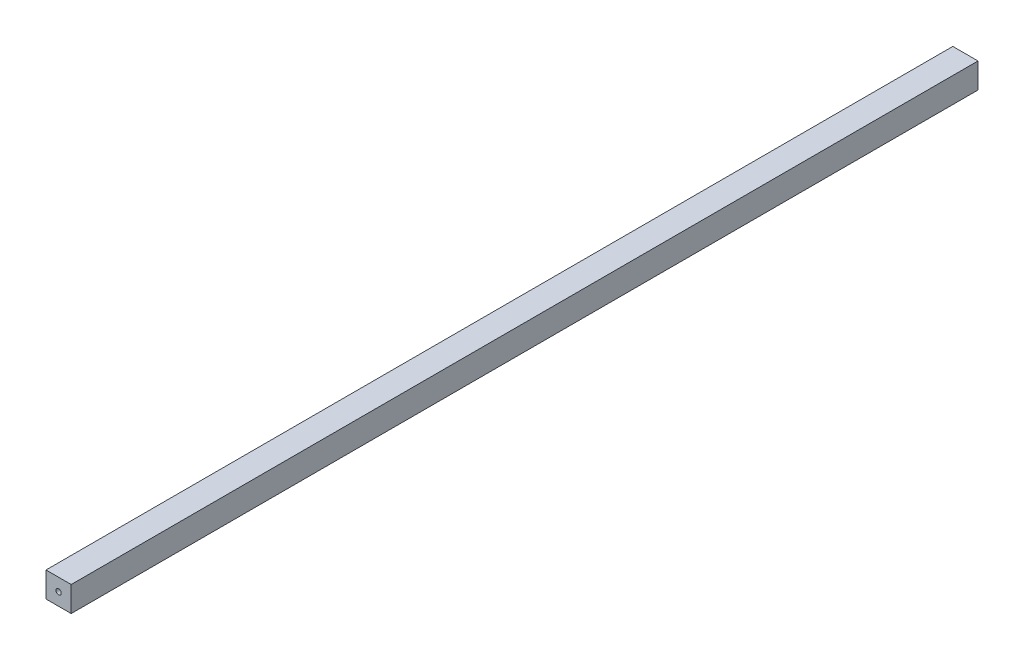
ISO-10303-21;
HEADER;
FILE_DESCRIPTION(('STEP AP214'),'2;1');
FILE_NAME('part.step','',(''),(''),'','','');
FILE_SCHEMA(('AUTOMOTIVE_DESIGN { 1 0 10303 214 1 1 1 1 }'));
ENDSEC;
DATA;
#1=APPLICATION_CONTEXT('core data for automotive mechanical design processes');
#2=APPLICATION_PROTOCOL_DEFINITION('international standard','automotive_design',2000,#1);
#3=PRODUCT_CONTEXT('',#1,'mechanical');
#4=PRODUCT('Part','Part','',(#3));
#5=PRODUCT_RELATED_PRODUCT_CATEGORY('part','',(#4));
#6=PRODUCT_DEFINITION_FORMATION('','',#4);
#7=PRODUCT_DEFINITION_CONTEXT('part definition',#1,'design');
#8=PRODUCT_DEFINITION('design','',#6,#7);
#9=PRODUCT_DEFINITION_SHAPE('','',#8);
#10=(LENGTH_UNIT() NAMED_UNIT(*) SI_UNIT(.MILLI.,.METRE.));
#11=(NAMED_UNIT(*) PLANE_ANGLE_UNIT() SI_UNIT($,.RADIAN.));
#12=(NAMED_UNIT(*) SI_UNIT($,.STERADIAN.) SOLID_ANGLE_UNIT());
#13=UNCERTAINTY_MEASURE_WITH_UNIT(LENGTH_MEASURE(1.E-05),#10,'distance_accuracy_value','');
#14=(GEOMETRIC_REPRESENTATION_CONTEXT(3) GLOBAL_UNCERTAINTY_ASSIGNED_CONTEXT((#13)) GLOBAL_UNIT_ASSIGNED_CONTEXT((#10,
#11,#12)) REPRESENTATION_CONTEXT('',''));
#15=CARTESIAN_POINT('',(0.,0.,0.));
#16=DIRECTION('',(0.,0.,1.));
#17=DIRECTION('',(1.,0.,0.));
#18=AXIS2_PLACEMENT_3D('',#15,#16,#17);
#19=CARTESIAN_POINT('',(0.,0.,-1.));
#20=DIRECTION('',(0.,0.,1.));
#21=DIRECTION('',(1.,0.,0.));
#22=AXIS2_PLACEMENT_3D('',#19,#20,#21);
#23=CYLINDRICAL_SURFACE('',#22,2.1);
#24=CARTESIAN_POINT('',(0.,0.,720.));
#25=DIRECTION('',(0.,0.,1.));
#26=DIRECTION('',(1.,0.,0.));
#27=AXIS2_PLACEMENT_3D('',#24,#25,#26);
#28=CIRCLE('',#27,2.1);
#29=CARTESIAN_POINT('',(2.1,0.,720.));
#30=VERTEX_POINT('',#29);
#31=EDGE_CURVE('E87',#30,#30,#28,.T.);
#32=ORIENTED_EDGE('',*,*,#31,.T.);
#33=EDGE_LOOP('',(#32));
#34=FACE_BOUND('',#33,.T.);
#35=CARTESIAN_POINT('',(0.,0.,0.));
#36=DIRECTION('',(0.,0.,1.));
#37=DIRECTION('',(1.,0.,0.));
#38=AXIS2_PLACEMENT_3D('',#35,#36,#37);
#39=CIRCLE('',#38,2.1);
#40=CARTESIAN_POINT('',(2.1,0.,0.));
#41=VERTEX_POINT('',#40);
#42=EDGE_CURVE('E10',#41,#41,#39,.T.);
#43=ORIENTED_EDGE('',*,*,#42,.F.);
#44=EDGE_LOOP('',(#43));
#45=FACE_BOUND('',#44,.T.);
#46=ADVANCED_FACE('F16',(#34,#45),#23,.F.);
#47=CARTESIAN_POINT('',(10.,-10.,0.));
#48=DIRECTION('',(1.,0.,0.));
#49=DIRECTION('',(0.,1.,0.));
#50=AXIS2_PLACEMENT_3D('',#47,#48,#49);
#51=PLANE('',#50);
#52=DIRECTION('',(0.,0.,1.));
#53=VECTOR('',#52,1.);
#54=CARTESIAN_POINT('',(10.,-10.,0.));
#55=LINE('',#54,#53);
#56=CARTESIAN_POINT('',(10.,-10.,0.));
#57=VERTEX_POINT('',#56);
#58=CARTESIAN_POINT('',(10.,-10.,720.));
#59=VERTEX_POINT('',#58);
#60=EDGE_CURVE('E108',#57,#59,#55,.T.);
#61=ORIENTED_EDGE('',*,*,#60,.F.);
#62=DIRECTION('',(0.,1.,0.));
#63=VECTOR('',#62,1.);
#64=CARTESIAN_POINT('',(10.,-10.,0.));
#65=LINE('',#64,#63);
#66=CARTESIAN_POINT('',(10.,10.,0.));
#67=VERTEX_POINT('',#66);
#68=EDGE_CURVE('E25',#57,#67,#65,.T.);
#69=ORIENTED_EDGE('',*,*,#68,.T.);
#70=DIRECTION('',(0.,0.,1.));
#71=VECTOR('',#70,1.);
#72=CARTESIAN_POINT('',(10.,10.,0.));
#73=LINE('',#72,#71);
#74=CARTESIAN_POINT('',(10.,10.,720.));
#75=VERTEX_POINT('',#74);
#76=EDGE_CURVE('E122',#67,#75,#73,.T.);
#77=ORIENTED_EDGE('',*,*,#76,.T.);
#78=DIRECTION('',(0.,1.,0.));
#79=VECTOR('',#78,1.);
#80=CARTESIAN_POINT('',(10.,-10.,720.));
#81=LINE('',#80,#79);
#82=EDGE_CURVE('E84',#59,#75,#81,.T.);
#83=ORIENTED_EDGE('',*,*,#82,.F.);
#84=EDGE_LOOP('',(#61,#69,#77,#83));
#85=FACE_BOUND('',#84,.T.);
#86=ADVANCED_FACE('F126',(#85),#51,.T.);
#87=CARTESIAN_POINT('',(-10.,-10.,0.));
#88=DIRECTION('',(0.,0.,1.));
#89=DIRECTION('',(1.,0.,0.));
#90=AXIS2_PLACEMENT_3D('',#87,#88,#89);
#91=PLANE('',#90);
#92=ORIENTED_EDGE('',*,*,#42,.T.);
#93=EDGE_LOOP('',(#92));
#94=FACE_BOUND('',#93,.T.);
#95=DIRECTION('',(1.,0.,0.));
#96=VECTOR('',#95,1.);
#97=CARTESIAN_POINT('',(-10.,10.,0.));
#98=LINE('',#97,#96);
#99=CARTESIAN_POINT('',(-10.,10.,0.));
#100=VERTEX_POINT('',#99);
#101=EDGE_CURVE('E92',#100,#67,#98,.T.);
#102=ORIENTED_EDGE('',*,*,#101,.T.);
#103=ORIENTED_EDGE('',*,*,#68,.F.);
#104=DIRECTION('',(1.,0.,0.));
#105=VECTOR('',#104,1.);
#106=CARTESIAN_POINT('',(-10.,-10.,0.));
#107=LINE('',#106,#105);
#108=CARTESIAN_POINT('',(-10.,-10.,0.));
#109=VERTEX_POINT('',#108);
#110=EDGE_CURVE('E63',#109,#57,#107,.T.);
#111=ORIENTED_EDGE('',*,*,#110,.F.);
#112=DIRECTION('',(0.,1.,0.));
#113=VECTOR('',#112,1.);
#114=CARTESIAN_POINT('',(-10.,-10.,0.));
#115=LINE('',#114,#113);
#116=EDGE_CURVE('E96',#109,#100,#115,.T.);
#117=ORIENTED_EDGE('',*,*,#116,.T.);
#118=EDGE_LOOP('',(#102,#103,#111,#117));
#119=FACE_BOUND('',#118,.T.);
#120=ADVANCED_FACE('F127',(#94,#119),#91,.F.);
#121=CARTESIAN_POINT('',(-10.,10.,0.));
#122=DIRECTION('',(0.,1.,0.));
#123=DIRECTION('',(1.,0.,0.));
#124=AXIS2_PLACEMENT_3D('',#121,#122,#123);
#125=PLANE('',#124);
#126=ORIENTED_EDGE('',*,*,#101,.F.);
#127=DIRECTION('',(0.,0.,1.));
#128=VECTOR('',#127,1.);
#129=CARTESIAN_POINT('',(-10.,10.,0.));
#130=LINE('',#129,#128);
#131=CARTESIAN_POINT('',(-10.,10.,720.));
#132=VERTEX_POINT('',#131);
#133=EDGE_CURVE('E90',#100,#132,#130,.T.);
#134=ORIENTED_EDGE('',*,*,#133,.T.);
#135=DIRECTION('',(1.,0.,0.));
#136=VECTOR('',#135,1.);
#137=CARTESIAN_POINT('',(-10.,10.,720.));
#138=LINE('',#137,#136);
#139=EDGE_CURVE('E79',#132,#75,#138,.T.);
#140=ORIENTED_EDGE('',*,*,#139,.T.);
#141=ORIENTED_EDGE('',*,*,#76,.F.);
#142=EDGE_LOOP('',(#126,#134,#140,#141));
#143=FACE_BOUND('',#142,.T.);
#144=ADVANCED_FACE('F91',(#143),#125,.T.);
#145=CARTESIAN_POINT('',(-10.,-10.,720.));
#146=DIRECTION('',(0.,0.,1.));
#147=DIRECTION('',(1.,0.,0.));
#148=AXIS2_PLACEMENT_3D('',#145,#146,#147);
#149=PLANE('',#148);
#150=ORIENTED_EDGE('',*,*,#31,.F.);
#151=EDGE_LOOP('',(#150));
#152=FACE_BOUND('',#151,.T.);
#153=DIRECTION('',(0.,1.,0.));
#154=VECTOR('',#153,1.);
#155=CARTESIAN_POINT('',(-10.,-10.,720.));
#156=LINE('',#155,#154);
#157=CARTESIAN_POINT('',(-10.,-10.,720.));
#158=VERTEX_POINT('',#157);
#159=EDGE_CURVE('E83',#158,#132,#156,.T.);
#160=ORIENTED_EDGE('',*,*,#159,.F.);
#161=DIRECTION('',(1.,0.,0.));
#162=VECTOR('',#161,1.);
#163=CARTESIAN_POINT('',(-10.,-10.,720.));
#164=LINE('',#163,#162);
#165=EDGE_CURVE('E71',#158,#59,#164,.T.);
#166=ORIENTED_EDGE('',*,*,#165,.T.);
#167=ORIENTED_EDGE('',*,*,#82,.T.);
#168=ORIENTED_EDGE('',*,*,#139,.F.);
#169=EDGE_LOOP('',(#160,#166,#167,#168));
#170=FACE_BOUND('',#169,.T.);
#171=ADVANCED_FACE('F81',(#152,#170),#149,.T.);
#172=CARTESIAN_POINT('',(-10.,-10.,0.));
#173=DIRECTION('',(0.,1.,0.));
#174=DIRECTION('',(1.,0.,0.));
#175=AXIS2_PLACEMENT_3D('',#172,#173,#174);
#176=PLANE('',#175);
#177=ORIENTED_EDGE('',*,*,#60,.T.);
#178=ORIENTED_EDGE('',*,*,#165,.F.);
#179=DIRECTION('',(0.,0.,1.));
#180=VECTOR('',#179,1.);
#181=CARTESIAN_POINT('',(-10.,-10.,0.));
#182=LINE('',#181,#180);
#183=EDGE_CURVE('E99',#109,#158,#182,.T.);
#184=ORIENTED_EDGE('',*,*,#183,.F.);
#185=ORIENTED_EDGE('',*,*,#110,.T.);
#186=EDGE_LOOP('',(#177,#178,#184,#185));
#187=FACE_BOUND('',#186,.T.);
#188=ADVANCED_FACE('F146',(#187),#176,.F.);
#189=CARTESIAN_POINT('',(-10.,-10.,0.));
#190=DIRECTION('',(1.,0.,0.));
#191=DIRECTION('',(0.,1.,0.));
#192=AXIS2_PLACEMENT_3D('',#189,#190,#191);
#193=PLANE('',#192);
#194=ORIENTED_EDGE('',*,*,#159,.T.);
#195=ORIENTED_EDGE('',*,*,#133,.F.);
#196=ORIENTED_EDGE('',*,*,#116,.F.);
#197=ORIENTED_EDGE('',*,*,#183,.T.);
#198=EDGE_LOOP('',(#194,#195,#196,#197));
#199=FACE_BOUND('',#198,.T.);
#200=ADVANCED_FACE('F98',(#199),#193,.F.);
#201=CLOSED_SHELL('',(#46,#86,#120,#144,#171,#188,#200));
#202=MANIFOLD_SOLID_BREP('B1',#201);
#203=ADVANCED_BREP_SHAPE_REPRESENTATION('',(#18,#202),#14);
#204=SHAPE_DEFINITION_REPRESENTATION(#9,#203);
ENDSEC;
END-ISO-10303-21;
